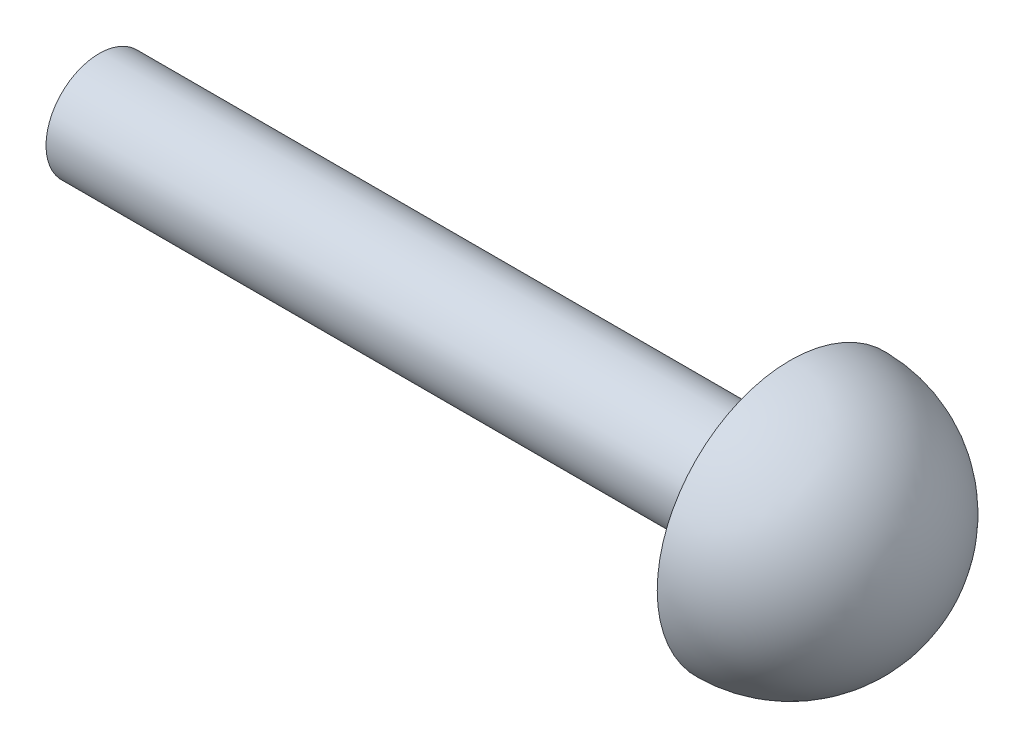
ISO-10303-21;
HEADER;
FILE_DESCRIPTION(('STEP AP214'),'2;1');
FILE_NAME('part.step','',(''),(''),'','','');
FILE_SCHEMA(('AUTOMOTIVE_DESIGN { 1 0 10303 214 1 1 1 1 }'));
ENDSEC;
DATA;
#1=APPLICATION_CONTEXT('core data for automotive mechanical design processes');
#2=APPLICATION_PROTOCOL_DEFINITION('international standard','automotive_design',2000,#1);
#3=PRODUCT_CONTEXT('',#1,'mechanical');
#4=PRODUCT('Part','Part','',(#3));
#5=PRODUCT_RELATED_PRODUCT_CATEGORY('part','',(#4));
#6=PRODUCT_DEFINITION_FORMATION('','',#4);
#7=PRODUCT_DEFINITION_CONTEXT('part definition',#1,'design');
#8=PRODUCT_DEFINITION('design','',#6,#7);
#9=PRODUCT_DEFINITION_SHAPE('','',#8);
#10=(LENGTH_UNIT() NAMED_UNIT(*) SI_UNIT(.MILLI.,.METRE.));
#11=(NAMED_UNIT(*) PLANE_ANGLE_UNIT() SI_UNIT($,.RADIAN.));
#12=(NAMED_UNIT(*) SI_UNIT($,.STERADIAN.) SOLID_ANGLE_UNIT());
#13=UNCERTAINTY_MEASURE_WITH_UNIT(LENGTH_MEASURE(1.E-05),#10,'distance_accuracy_value','');
#14=(GEOMETRIC_REPRESENTATION_CONTEXT(3) GLOBAL_UNCERTAINTY_ASSIGNED_CONTEXT((#13)) GLOBAL_UNIT_ASSIGNED_CONTEXT((#10,
#11,#12)) REPRESENTATION_CONTEXT('',''));
#15=CARTESIAN_POINT('',(0.,0.,0.));
#16=DIRECTION('',(0.,0.,1.));
#17=DIRECTION('',(1.,0.,0.));
#18=AXIS2_PLACEMENT_3D('',#15,#16,#17);
#19=CARTESIAN_POINT('',(26.,0.,0.));
#20=DIRECTION('',(-1.,0.,0.));
#21=DIRECTION('',(0.,1.,0.));
#22=AXIS2_PLACEMENT_3D('',#19,#20,#21);
#23=SPHERICAL_SURFACE('',#22,5.);
#24=CARTESIAN_POINT('',(26.,0.,0.));
#25=DIRECTION('',(-1.,0.,0.));
#26=DIRECTION('',(0.,0.,1.));
#27=AXIS2_PLACEMENT_3D('',#24,#25,#26);
#28=CIRCLE('',#27,5.);
#29=CARTESIAN_POINT('',(26.,0.,5.));
#30=VERTEX_POINT('',#29);
#31=EDGE_CURVE('E10',#30,#30,#28,.T.);
#32=ORIENTED_EDGE('',*,*,#31,.F.);
#33=EDGE_LOOP('',(#32));
#34=FACE_BOUND('',#33,.T.);
#35=ADVANCED_FACE('F47',(#34),#23,.T.);
#36=CARTESIAN_POINT('',(26.,2.,0.));
#37=DIRECTION('',(1.,0.,0.));
#38=DIRECTION('',(0.,0.,-1.));
#39=AXIS2_PLACEMENT_3D('',#36,#37,#38);
#40=PLANE('',#39);
#41=CARTESIAN_POINT('',(26.,0.,0.));
#42=DIRECTION('',(-1.,0.,0.));
#43=DIRECTION('',(0.,0.,1.));
#44=AXIS2_PLACEMENT_3D('',#41,#42,#43);
#45=CIRCLE('',#44,2.);
#46=CARTESIAN_POINT('',(26.,0.,2.));
#47=VERTEX_POINT('',#46);
#48=EDGE_CURVE('E54',#47,#47,#45,.T.);
#49=ORIENTED_EDGE('',*,*,#48,.F.);
#50=EDGE_LOOP('',(#49));
#51=FACE_BOUND('',#50,.T.);
#52=ORIENTED_EDGE('',*,*,#31,.T.);
#53=EDGE_LOOP('',(#52));
#54=FACE_BOUND('',#53,.T.);
#55=ADVANCED_FACE('F71',(#51,#54),#40,.F.);
#56=CARTESIAN_POINT('',(0.,0.,0.));
#57=DIRECTION('',(-1.,0.,0.));
#58=DIRECTION('',(0.,0.,1.));
#59=AXIS2_PLACEMENT_3D('',#56,#57,#58);
#60=CYLINDRICAL_SURFACE('',#59,2.);
#61=CARTESIAN_POINT('',(0.,0.,0.));
#62=DIRECTION('',(-1.,0.,0.));
#63=DIRECTION('',(0.,0.,1.));
#64=AXIS2_PLACEMENT_3D('',#61,#62,#63);
#65=CIRCLE('',#64,2.);
#66=CARTESIAN_POINT('',(0.,0.,2.));
#67=VERTEX_POINT('',#66);
#68=EDGE_CURVE('E59',#67,#67,#65,.T.);
#69=ORIENTED_EDGE('',*,*,#68,.F.);
#70=EDGE_LOOP('',(#69));
#71=FACE_BOUND('',#70,.T.);
#72=ORIENTED_EDGE('',*,*,#48,.T.);
#73=EDGE_LOOP('',(#72));
#74=FACE_BOUND('',#73,.T.);
#75=ADVANCED_FACE('F69',(#71,#74),#60,.T.);
#76=CARTESIAN_POINT('',(0.,0.,0.));
#77=DIRECTION('',(1.,0.,0.));
#78=DIRECTION('',(0.,0.,-1.));
#79=AXIS2_PLACEMENT_3D('',#76,#77,#78);
#80=PLANE('',#79);
#81=ORIENTED_EDGE('',*,*,#68,.T.);
#82=EDGE_LOOP('',(#81));
#83=FACE_BOUND('',#82,.T.);
#84=ADVANCED_FACE('F67',(#83),#80,.F.);
#85=CLOSED_SHELL('',(#35,#55,#75,#84));
#86=MANIFOLD_SOLID_BREP('B2',#85);
#87=ADVANCED_BREP_SHAPE_REPRESENTATION('',(#18,#86),#14);
#88=SHAPE_DEFINITION_REPRESENTATION(#9,#87);
ENDSEC;
END-ISO-10303-21;
